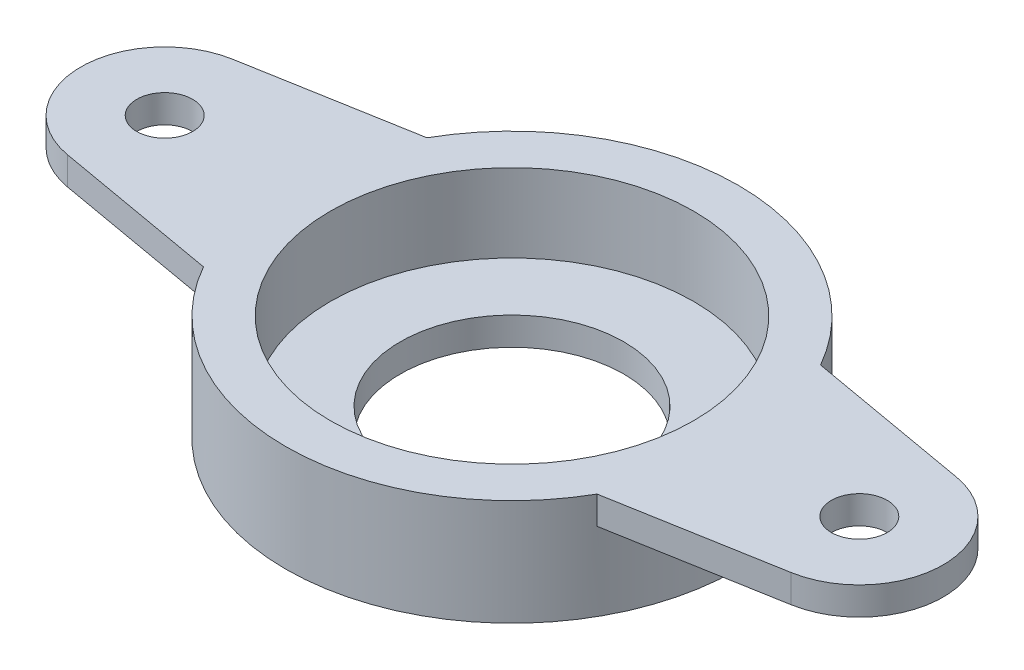
ISO-10303-21;
HEADER;
FILE_DESCRIPTION(('STEP AP214'),'2;1');
FILE_NAME('part.step','',(''),(''),'','','');
FILE_SCHEMA(('AUTOMOTIVE_DESIGN { 1 0 10303 214 1 1 1 1 }'));
ENDSEC;
DATA;
#1=APPLICATION_CONTEXT('core data for automotive mechanical design processes');
#2=APPLICATION_PROTOCOL_DEFINITION('international standard','automotive_design',2000,#1);
#3=PRODUCT_CONTEXT('',#1,'mechanical');
#4=PRODUCT('Part','Part','',(#3));
#5=PRODUCT_RELATED_PRODUCT_CATEGORY('part','',(#4));
#6=PRODUCT_DEFINITION_FORMATION('','',#4);
#7=PRODUCT_DEFINITION_CONTEXT('part definition',#1,'design');
#8=PRODUCT_DEFINITION('design','',#6,#7);
#9=PRODUCT_DEFINITION_SHAPE('','',#8);
#10=(LENGTH_UNIT() NAMED_UNIT(*) SI_UNIT(.MILLI.,.METRE.));
#11=(NAMED_UNIT(*) PLANE_ANGLE_UNIT() SI_UNIT($,.RADIAN.));
#12=(NAMED_UNIT(*) SI_UNIT($,.STERADIAN.) SOLID_ANGLE_UNIT());
#13=UNCERTAINTY_MEASURE_WITH_UNIT(LENGTH_MEASURE(1.E-05),#10,'distance_accuracy_value','');
#14=(GEOMETRIC_REPRESENTATION_CONTEXT(3) GLOBAL_UNCERTAINTY_ASSIGNED_CONTEXT((#13)) GLOBAL_UNIT_ASSIGNED_CONTEXT((#10,
#11,#12)) REPRESENTATION_CONTEXT('',''));
#15=CARTESIAN_POINT('',(0.,0.,0.));
#16=DIRECTION('',(0.,0.,1.));
#17=DIRECTION('',(1.,0.,0.));
#18=AXIS2_PLACEMENT_3D('',#15,#16,#17);
#19=CARTESIAN_POINT('',(0.,8.89,0.));
#20=DIRECTION('',(0.,1.,0.));
#21=DIRECTION('',(0.,0.,1.));
#22=AXIS2_PLACEMENT_3D('',#19,#20,#21);
#23=PLANE('',#22);
#24=CARTESIAN_POINT('',(0.,8.89,0.));
#25=DIRECTION('',(0.,1.,0.));
#26=DIRECTION('',(0.,0.,1.));
#27=AXIS2_PLACEMENT_3D('',#24,#25,#26);
#28=CIRCLE('',#27,25.7175);
#29=CARTESIAN_POINT('',(22.3629113992342,8.89,-12.7));
#30=VERTEX_POINT('',#29);
#31=CARTESIAN_POINT('',(-22.3629113992342,8.89,-12.7));
#32=VERTEX_POINT('',#31);
#33=EDGE_CURVE('E11',#30,#32,#28,.T.);
#34=ORIENTED_EDGE('',*,*,#33,.T.);
#35=DIRECTION('',(-0.984807753012208,0.,0.173648177666931));
#36=VECTOR('',#35,1.);
#37=CARTESIAN_POINT('',(-22.3629113992342,8.89,-12.7));
#38=LINE('',#37,#36);
#39=CARTESIAN_POINT('',(-41.1234990941168,8.89,-9.39200221544497));
#40=VERTEX_POINT('',#39);
#41=EDGE_CURVE('E121',#32,#40,#38,.T.);
#42=ORIENTED_EDGE('',*,*,#41,.T.);
#43=CARTESIAN_POINT('',(-39.4674357006602,8.89,0.));
#44=DIRECTION('',(0.,1.,0.));
#45=DIRECTION('',(0.,0.,1.));
#46=AXIS2_PLACEMENT_3D('',#43,#44,#45);
#47=CIRCLE('',#46,9.53688898845269);
#48=CARTESIAN_POINT('',(-41.1234990941168,8.89,9.39200221544496));
#49=VERTEX_POINT('',#48);
#50=EDGE_CURVE('E131',#40,#49,#47,.T.);
#51=ORIENTED_EDGE('',*,*,#50,.T.);
#52=DIRECTION('',(0.984807753012208,0.,0.173648177666931));
#53=VECTOR('',#52,1.);
#54=CARTESIAN_POINT('',(-22.3629113992342,8.89,12.7));
#55=LINE('',#54,#53);
#56=CARTESIAN_POINT('',(-22.3629113992342,8.89,12.7));
#57=VERTEX_POINT('',#56);
#58=EDGE_CURVE('E49',#49,#57,#55,.T.);
#59=ORIENTED_EDGE('',*,*,#58,.T.);
#60=CARTESIAN_POINT('',(22.3629113992342,8.89,12.7));
#61=VERTEX_POINT('',#60);
#62=EDGE_CURVE('E42',#57,#61,#28,.T.);
#63=ORIENTED_EDGE('',*,*,#62,.T.);
#64=DIRECTION('',(0.984807753012208,0.,-0.173648177666931));
#65=VECTOR('',#64,1.);
#66=CARTESIAN_POINT('',(22.3629113992342,8.89,12.7));
#67=LINE('',#66,#65);
#68=CARTESIAN_POINT('',(41.1234990941168,8.89,9.39200221544496));
#69=VERTEX_POINT('',#68);
#70=EDGE_CURVE('E144',#61,#69,#67,.T.);
#71=ORIENTED_EDGE('',*,*,#70,.T.);
#72=CARTESIAN_POINT('',(39.4674357006602,8.89,0.));
#73=DIRECTION('',(0.,1.,0.));
#74=DIRECTION('',(0.,0.,-1.));
#75=AXIS2_PLACEMENT_3D('',#72,#73,#74);
#76=CIRCLE('',#75,9.53688898845269);
#77=CARTESIAN_POINT('',(41.1234990941168,8.89,-9.39200221544497));
#78=VERTEX_POINT('',#77);
#79=EDGE_CURVE('E162',#69,#78,#76,.T.);
#80=ORIENTED_EDGE('',*,*,#79,.T.);
#81=DIRECTION('',(-0.984807753012208,0.,-0.173648177666931));
#82=VECTOR('',#81,1.);
#83=CARTESIAN_POINT('',(22.3629113992342,8.89,-12.7));
#84=LINE('',#83,#82);
#85=EDGE_CURVE('E55',#78,#30,#84,.T.);
#86=ORIENTED_EDGE('',*,*,#85,.T.);
#87=EDGE_LOOP('',(#34,#42,#51,#59,#63,#71,#80,#86));
#88=FACE_BOUND('',#87,.T.);
#89=CARTESIAN_POINT('',(0.,8.89,0.));
#90=DIRECTION('',(0.,1.,0.));
#91=DIRECTION('',(0.,0.,1.));
#92=AXIS2_PLACEMENT_3D('',#89,#90,#91);
#93=CIRCLE('',#92,20.6375);
#94=CARTESIAN_POINT('',(0.,8.89,20.6375));
#95=VERTEX_POINT('',#94);
#96=EDGE_CURVE('E183',#95,#95,#93,.T.);
#97=ORIENTED_EDGE('',*,*,#96,.F.);
#98=EDGE_LOOP('',(#97));
#99=FACE_BOUND('',#98,.T.);
#100=CARTESIAN_POINT('',(39.4674357006602,8.89,0.));
#101=DIRECTION('',(0.,1.,0.));
#102=DIRECTION('',(0.,0.,1.));
#103=AXIS2_PLACEMENT_3D('',#100,#101,#102);
#104=CIRCLE('',#103,3.175);
#105=CARTESIAN_POINT('',(39.4674357006602,8.89,3.17499999999999));
#106=VERTEX_POINT('',#105);
#107=EDGE_CURVE('E136',#106,#106,#104,.T.);
#108=ORIENTED_EDGE('',*,*,#107,.F.);
#109=EDGE_LOOP('',(#108));
#110=FACE_BOUND('',#109,.T.);
#111=CARTESIAN_POINT('',(-39.4674357006602,8.89,0.));
#112=DIRECTION('',(0.,1.,0.));
#113=DIRECTION('',(0.,0.,-1.));
#114=AXIS2_PLACEMENT_3D('',#111,#112,#113);
#115=CIRCLE('',#114,3.175);
#116=CARTESIAN_POINT('',(-39.4674357006602,8.89,-3.175));
#117=VERTEX_POINT('',#116);
#118=EDGE_CURVE('E126',#117,#117,#115,.T.);
#119=ORIENTED_EDGE('',*,*,#118,.F.);
#120=EDGE_LOOP('',(#119));
#121=FACE_BOUND('',#120,.T.);
#122=ADVANCED_FACE('F34',(#88,#99,#110,#121),#23,.T.);
#123=CARTESIAN_POINT('',(0.,8.89,0.));
#124=DIRECTION('',(0.,-1.,0.));
#125=DIRECTION('',(0.,0.,-1.));
#126=AXIS2_PLACEMENT_3D('',#123,#124,#125);
#127=CYLINDRICAL_SURFACE('',#126,25.7175);
#128=CARTESIAN_POINT('',(0.,5.715,0.));
#129=DIRECTION('',(0.,-1.,0.));
#130=DIRECTION('',(0.,0.,1.));
#131=AXIS2_PLACEMENT_3D('',#128,#129,#130);
#132=CIRCLE('',#131,25.7175);
#133=CARTESIAN_POINT('',(-22.3629113992342,5.715,12.7));
#134=VERTEX_POINT('',#133);
#135=CARTESIAN_POINT('',(-22.3629113992342,5.715,-12.7));
#136=VERTEX_POINT('',#135);
#137=EDGE_CURVE('E117',#134,#136,#132,.T.);
#138=ORIENTED_EDGE('',*,*,#137,.T.);
#139=DIRECTION('',(0.,1.,0.));
#140=VECTOR('',#139,1.);
#141=CARTESIAN_POINT('',(-22.3629113992342,5.715,-12.7));
#142=LINE('',#141,#140);
#143=EDGE_CURVE('E137',#136,#32,#142,.T.);
#144=ORIENTED_EDGE('',*,*,#143,.T.);
#145=ORIENTED_EDGE('',*,*,#33,.F.);
#146=DIRECTION('',(0.,1.,0.));
#147=VECTOR('',#146,1.);
#148=CARTESIAN_POINT('',(22.3629113992342,5.715,-12.7));
#149=LINE('',#148,#147);
#150=CARTESIAN_POINT('',(22.3629113992342,5.715,-12.7));
#151=VERTEX_POINT('',#150);
#152=EDGE_CURVE('E165',#151,#30,#149,.T.);
#153=ORIENTED_EDGE('',*,*,#152,.F.);
#154=CARTESIAN_POINT('',(0.,5.715,0.));
#155=DIRECTION('',(0.,-1.,0.));
#156=DIRECTION('',(0.,0.,-1.));
#157=AXIS2_PLACEMENT_3D('',#154,#155,#156);
#158=CIRCLE('',#157,25.7175);
#159=CARTESIAN_POINT('',(22.3629113992342,5.715,12.7));
#160=VERTEX_POINT('',#159);
#161=EDGE_CURVE('E147',#151,#160,#158,.T.);
#162=ORIENTED_EDGE('',*,*,#161,.T.);
#163=DIRECTION('',(0.,1.,0.));
#164=VECTOR('',#163,1.);
#165=CARTESIAN_POINT('',(22.3629113992342,5.715,12.7));
#166=LINE('',#165,#164);
#167=EDGE_CURVE('E159',#160,#61,#166,.T.);
#168=ORIENTED_EDGE('',*,*,#167,.T.);
#169=ORIENTED_EDGE('',*,*,#62,.F.);
#170=DIRECTION('',(0.,1.,0.));
#171=VECTOR('',#170,1.);
#172=CARTESIAN_POINT('',(-22.3629113992342,5.715,12.7));
#173=LINE('',#172,#171);
#174=EDGE_CURVE('E107',#134,#57,#173,.T.);
#175=ORIENTED_EDGE('',*,*,#174,.F.);
#176=EDGE_LOOP('',(#138,#144,#145,#153,#162,#168,#169,#175));
#177=FACE_BOUND('',#176,.T.);
#178=CARTESIAN_POINT('',(0.,-3.175,0.));
#179=DIRECTION('',(0.,-1.,0.));
#180=DIRECTION('',(0.,0.,-1.));
#181=AXIS2_PLACEMENT_3D('',#178,#179,#180);
#182=CIRCLE('',#181,25.7175);
#183=CARTESIAN_POINT('',(0.,-3.175,-25.7175));
#184=VERTEX_POINT('',#183);
#185=EDGE_CURVE('E177',#184,#184,#182,.T.);
#186=ORIENTED_EDGE('',*,*,#185,.F.);
#187=EDGE_LOOP('',(#186));
#188=FACE_BOUND('',#187,.T.);
#189=ADVANCED_FACE('F36',(#177,#188),#127,.T.);
#190=CARTESIAN_POINT('',(0.,8.89,0.));
#191=DIRECTION('',(0.,-1.,0.));
#192=DIRECTION('',(0.,0.,-1.));
#193=AXIS2_PLACEMENT_3D('',#190,#191,#192);
#194=CYLINDRICAL_SURFACE('',#193,20.6375);
#195=ORIENTED_EDGE('',*,*,#96,.T.);
#196=EDGE_LOOP('',(#195));
#197=FACE_BOUND('',#196,.T.);
#198=CARTESIAN_POINT('',(0.,0.,0.));
#199=DIRECTION('',(0.,1.,0.));
#200=DIRECTION('',(0.,0.,1.));
#201=AXIS2_PLACEMENT_3D('',#198,#199,#200);
#202=CIRCLE('',#201,20.6375);
#203=CARTESIAN_POINT('',(0.,0.,20.6375));
#204=VERTEX_POINT('',#203);
#205=EDGE_CURVE('E182',#204,#204,#202,.T.);
#206=ORIENTED_EDGE('',*,*,#205,.F.);
#207=EDGE_LOOP('',(#206));
#208=FACE_BOUND('',#207,.T.);
#209=ADVANCED_FACE('F190',(#197,#208),#194,.F.);
#210=CARTESIAN_POINT('',(0.,0.,0.));
#211=DIRECTION('',(0.,-1.,0.));
#212=DIRECTION('',(0.,0.,-1.));
#213=AXIS2_PLACEMENT_3D('',#210,#211,#212);
#214=PLANE('',#213);
#215=CARTESIAN_POINT('',(0.,0.,0.));
#216=DIRECTION('',(0.,-1.,0.));
#217=DIRECTION('',(0.,0.,-1.));
#218=AXIS2_PLACEMENT_3D('',#215,#216,#217);
#219=CIRCLE('',#218,12.7);
#220=CARTESIAN_POINT('',(0.,0.,-12.7));
#221=VERTEX_POINT('',#220);
#222=EDGE_CURVE('E167',#221,#221,#219,.T.);
#223=ORIENTED_EDGE('',*,*,#222,.T.);
#224=EDGE_LOOP('',(#223));
#225=FACE_BOUND('',#224,.T.);
#226=ORIENTED_EDGE('',*,*,#205,.T.);
#227=EDGE_LOOP('',(#226));
#228=FACE_BOUND('',#227,.T.);
#229=ADVANCED_FACE('F188',(#225,#228),#214,.F.);
#230=CARTESIAN_POINT('',(0.,-3.175,0.));
#231=DIRECTION('',(0.,-1.,0.));
#232=DIRECTION('',(0.,0.,-1.));
#233=AXIS2_PLACEMENT_3D('',#230,#231,#232);
#234=PLANE('',#233);
#235=ORIENTED_EDGE('',*,*,#185,.T.);
#236=EDGE_LOOP('',(#235));
#237=FACE_BOUND('',#236,.T.);
#238=CARTESIAN_POINT('',(0.,-3.175,0.));
#239=DIRECTION('',(0.,-1.,0.));
#240=DIRECTION('',(0.,0.,-1.));
#241=AXIS2_PLACEMENT_3D('',#238,#239,#240);
#242=CIRCLE('',#241,12.7);
#243=CARTESIAN_POINT('',(0.,-3.175,-12.7));
#244=VERTEX_POINT('',#243);
#245=EDGE_CURVE('E174',#244,#244,#242,.T.);
#246=ORIENTED_EDGE('',*,*,#245,.F.);
#247=EDGE_LOOP('',(#246));
#248=FACE_BOUND('',#247,.T.);
#249=ADVANCED_FACE('F198',(#237,#248),#234,.T.);
#250=CARTESIAN_POINT('',(0.,-3.175,0.));
#251=DIRECTION('',(0.,1.,0.));
#252=DIRECTION('',(0.,0.,1.));
#253=AXIS2_PLACEMENT_3D('',#250,#251,#252);
#254=CYLINDRICAL_SURFACE('',#253,12.7);
#255=ORIENTED_EDGE('',*,*,#245,.T.);
#256=EDGE_LOOP('',(#255));
#257=FACE_BOUND('',#256,.T.);
#258=ORIENTED_EDGE('',*,*,#222,.F.);
#259=EDGE_LOOP('',(#258));
#260=FACE_BOUND('',#259,.T.);
#261=ADVANCED_FACE('F247',(#257,#260),#254,.F.);
#262=CARTESIAN_POINT('',(22.3629113992342,5.715,-12.7));
#263=DIRECTION('',(0.173648177666931,0.,-0.984807753012208));
#264=DIRECTION('',(-0.984807753012208,0.,-0.173648177666931));
#265=AXIS2_PLACEMENT_3D('',#262,#263,#264);
#266=PLANE('',#265);
#267=ORIENTED_EDGE('',*,*,#85,.F.);
#268=DIRECTION('',(0.,1.,0.));
#269=VECTOR('',#268,1.);
#270=CARTESIAN_POINT('',(41.1234990941168,5.715,-9.39200221544497));
#271=LINE('',#270,#269);
#272=CARTESIAN_POINT('',(41.1234990941168,5.715,-9.39200221544497));
#273=VERTEX_POINT('',#272);
#274=EDGE_CURVE('E168',#273,#78,#271,.T.);
#275=ORIENTED_EDGE('',*,*,#274,.F.);
#276=DIRECTION('',(-0.984807753012208,0.,-0.173648177666931));
#277=VECTOR('',#276,1.);
#278=CARTESIAN_POINT('',(22.3629113992342,5.715,-12.7));
#279=LINE('',#278,#277);
#280=EDGE_CURVE('E156',#273,#151,#279,.T.);
#281=ORIENTED_EDGE('',*,*,#280,.T.);
#282=ORIENTED_EDGE('',*,*,#152,.T.);
#283=EDGE_LOOP('',(#267,#275,#281,#282));
#284=FACE_BOUND('',#283,.T.);
#285=ADVANCED_FACE('F243',(#284),#266,.T.);
#286=CARTESIAN_POINT('',(39.4674357006602,5.715,0.));
#287=DIRECTION('',(0.,1.,0.));
#288=DIRECTION('',(0.,0.,1.));
#289=AXIS2_PLACEMENT_3D('',#286,#287,#288);
#290=CYLINDRICAL_SURFACE('',#289,9.53688898845269);
#291=ORIENTED_EDGE('',*,*,#79,.F.);
#292=DIRECTION('',(0.,1.,0.));
#293=VECTOR('',#292,1.);
#294=CARTESIAN_POINT('',(41.1234990941168,5.715,9.39200221544496));
#295=LINE('',#294,#293);
#296=CARTESIAN_POINT('',(41.1234990941168,5.715,9.39200221544496));
#297=VERTEX_POINT('',#296);
#298=EDGE_CURVE('E170',#297,#69,#295,.T.);
#299=ORIENTED_EDGE('',*,*,#298,.F.);
#300=CARTESIAN_POINT('',(39.4674357006602,5.715,0.));
#301=DIRECTION('',(0.,1.,0.));
#302=DIRECTION('',(0.,0.,-1.));
#303=AXIS2_PLACEMENT_3D('',#300,#301,#302);
#304=CIRCLE('',#303,9.53688898845269);
#305=EDGE_CURVE('E153',#297,#273,#304,.T.);
#306=ORIENTED_EDGE('',*,*,#305,.T.);
#307=ORIENTED_EDGE('',*,*,#274,.T.);
#308=EDGE_LOOP('',(#291,#299,#306,#307));
#309=FACE_BOUND('',#308,.T.);
#310=ADVANCED_FACE('F246',(#309),#290,.T.);
#311=CARTESIAN_POINT('',(22.3629113992342,5.715,12.7));
#312=DIRECTION('',(0.173648177666931,0.,0.984807753012208));
#313=DIRECTION('',(0.984807753012208,0.,-0.173648177666931));
#314=AXIS2_PLACEMENT_3D('',#311,#312,#313);
#315=PLANE('',#314);
#316=ORIENTED_EDGE('',*,*,#70,.F.);
#317=ORIENTED_EDGE('',*,*,#167,.F.);
#318=DIRECTION('',(0.984807753012208,0.,-0.173648177666931));
#319=VECTOR('',#318,1.);
#320=CARTESIAN_POINT('',(22.3629113992342,5.715,12.7));
#321=LINE('',#320,#319);
#322=EDGE_CURVE('E150',#160,#297,#321,.T.);
#323=ORIENTED_EDGE('',*,*,#322,.T.);
#324=ORIENTED_EDGE('',*,*,#298,.T.);
#325=EDGE_LOOP('',(#316,#317,#323,#324));
#326=FACE_BOUND('',#325,.T.);
#327=ADVANCED_FACE('F241',(#326),#315,.T.);
#328=CARTESIAN_POINT('',(0.,5.715,0.));
#329=DIRECTION('',(0.,-1.,0.));
#330=DIRECTION('',(0.,0.,-1.));
#331=AXIS2_PLACEMENT_3D('',#328,#329,#330);
#332=PLANE('',#331);
#333=CARTESIAN_POINT('',(39.4674357006602,5.715,0.));
#334=DIRECTION('',(0.,1.,0.));
#335=DIRECTION('',(0.,0.,1.));
#336=AXIS2_PLACEMENT_3D('',#333,#334,#335);
#337=CIRCLE('',#336,3.175);
#338=CARTESIAN_POINT('',(39.4674357006602,5.715,3.17499999999999));
#339=VERTEX_POINT('',#338);
#340=EDGE_CURVE('E141',#339,#339,#337,.T.);
#341=ORIENTED_EDGE('',*,*,#340,.T.);
#342=EDGE_LOOP('',(#341));
#343=FACE_BOUND('',#342,.T.);
#344=ORIENTED_EDGE('',*,*,#161,.F.);
#345=ORIENTED_EDGE('',*,*,#280,.F.);
#346=ORIENTED_EDGE('',*,*,#305,.F.);
#347=ORIENTED_EDGE('',*,*,#322,.F.);
#348=EDGE_LOOP('',(#344,#345,#346,#347));
#349=FACE_BOUND('',#348,.T.);
#350=ADVANCED_FACE('F237',(#343,#349),#332,.T.);
#351=CARTESIAN_POINT('',(39.4674357006602,5.715,0.));
#352=DIRECTION('',(0.,1.,0.));
#353=DIRECTION('',(0.,0.,1.));
#354=AXIS2_PLACEMENT_3D('',#351,#352,#353);
#355=CYLINDRICAL_SURFACE('',#354,3.175);
#356=ORIENTED_EDGE('',*,*,#340,.F.);
#357=EDGE_LOOP('',(#356));
#358=FACE_BOUND('',#357,.T.);
#359=ORIENTED_EDGE('',*,*,#107,.T.);
#360=EDGE_LOOP('',(#359));
#361=FACE_BOUND('',#360,.T.);
#362=ADVANCED_FACE('F234',(#358,#361),#355,.F.);
#363=CARTESIAN_POINT('',(-39.4674357006602,5.715,0.));
#364=DIRECTION('',(0.,1.,0.));
#365=DIRECTION('',(0.,0.,1.));
#366=AXIS2_PLACEMENT_3D('',#363,#364,#365);
#367=CYLINDRICAL_SURFACE('',#366,9.53688898845269);
#368=ORIENTED_EDGE('',*,*,#50,.F.);
#369=DIRECTION('',(0.,1.,0.));
#370=VECTOR('',#369,1.);
#371=CARTESIAN_POINT('',(-41.1234990941168,5.715,-9.39200221544497));
#372=LINE('',#371,#370);
#373=CARTESIAN_POINT('',(-41.1234990941168,5.715,-9.39200221544497));
#374=VERTEX_POINT('',#373);
#375=EDGE_CURVE('E120',#374,#40,#372,.T.);
#376=ORIENTED_EDGE('',*,*,#375,.F.);
#377=CARTESIAN_POINT('',(-39.4674357006602,5.715,0.));
#378=DIRECTION('',(0.,1.,0.));
#379=DIRECTION('',(0.,0.,1.));
#380=AXIS2_PLACEMENT_3D('',#377,#378,#379);
#381=CIRCLE('',#380,9.53688898845269);
#382=CARTESIAN_POINT('',(-41.1234990941168,5.715,9.39200221544496));
#383=VERTEX_POINT('',#382);
#384=EDGE_CURVE('E114',#374,#383,#381,.T.);
#385=ORIENTED_EDGE('',*,*,#384,.T.);
#386=DIRECTION('',(0.,1.,0.));
#387=VECTOR('',#386,1.);
#388=CARTESIAN_POINT('',(-41.1234990941168,5.715,9.39200221544496));
#389=LINE('',#388,#387);
#390=EDGE_CURVE('E99',#383,#49,#389,.T.);
#391=ORIENTED_EDGE('',*,*,#390,.T.);
#392=EDGE_LOOP('',(#368,#376,#385,#391));
#393=FACE_BOUND('',#392,.T.);
#394=ADVANCED_FACE('F119',(#393),#367,.T.);
#395=CARTESIAN_POINT('',(-22.3629113992342,5.715,-12.7));
#396=DIRECTION('',(-0.173648177666931,0.,-0.984807753012208));
#397=DIRECTION('',(-0.984807753012208,0.,0.173648177666931));
#398=AXIS2_PLACEMENT_3D('',#395,#396,#397);
#399=PLANE('',#398);
#400=ORIENTED_EDGE('',*,*,#41,.F.);
#401=ORIENTED_EDGE('',*,*,#143,.F.);
#402=DIRECTION('',(-0.984807753012208,0.,0.173648177666931));
#403=VECTOR('',#402,1.);
#404=CARTESIAN_POINT('',(-22.3629113992342,5.715,-12.7));
#405=LINE('',#404,#403);
#406=EDGE_CURVE('E108',#136,#374,#405,.T.);
#407=ORIENTED_EDGE('',*,*,#406,.T.);
#408=ORIENTED_EDGE('',*,*,#375,.T.);
#409=EDGE_LOOP('',(#400,#401,#407,#408));
#410=FACE_BOUND('',#409,.T.);
#411=ADVANCED_FACE('F226',(#410),#399,.T.);
#412=CARTESIAN_POINT('',(-22.3629113992342,5.715,12.7));
#413=DIRECTION('',(-0.173648177666931,0.,0.984807753012208));
#414=DIRECTION('',(0.984807753012208,0.,0.173648177666931));
#415=AXIS2_PLACEMENT_3D('',#412,#413,#414);
#416=PLANE('',#415);
#417=ORIENTED_EDGE('',*,*,#58,.F.);
#418=ORIENTED_EDGE('',*,*,#390,.F.);
#419=DIRECTION('',(0.984807753012208,0.,0.173648177666931));
#420=VECTOR('',#419,1.);
#421=CARTESIAN_POINT('',(-22.3629113992342,5.715,12.7));
#422=LINE('',#421,#420);
#423=EDGE_CURVE('E102',#383,#134,#422,.T.);
#424=ORIENTED_EDGE('',*,*,#423,.T.);
#425=ORIENTED_EDGE('',*,*,#174,.T.);
#426=EDGE_LOOP('',(#417,#418,#424,#425));
#427=FACE_BOUND('',#426,.T.);
#428=ADVANCED_FACE('F101',(#427),#416,.T.);
#429=CARTESIAN_POINT('',(-39.4674357006602,5.715,0.));
#430=DIRECTION('',(0.,1.,0.));
#431=DIRECTION('',(0.,0.,1.));
#432=AXIS2_PLACEMENT_3D('',#429,#430,#431);
#433=PLANE('',#432);
#434=CARTESIAN_POINT('',(-39.4674357006602,5.715,0.));
#435=DIRECTION('',(0.,1.,0.));
#436=DIRECTION('',(0.,0.,-1.));
#437=AXIS2_PLACEMENT_3D('',#434,#435,#436);
#438=CIRCLE('',#437,3.175);
#439=CARTESIAN_POINT('',(-39.4674357006602,5.715,-3.175));
#440=VERTEX_POINT('',#439);
#441=EDGE_CURVE('E133',#440,#440,#438,.T.);
#442=ORIENTED_EDGE('',*,*,#441,.T.);
#443=EDGE_LOOP('',(#442));
#444=FACE_BOUND('',#443,.T.);
#445=ORIENTED_EDGE('',*,*,#384,.F.);
#446=ORIENTED_EDGE('',*,*,#406,.F.);
#447=ORIENTED_EDGE('',*,*,#137,.F.);
#448=ORIENTED_EDGE('',*,*,#423,.F.);
#449=EDGE_LOOP('',(#445,#446,#447,#448));
#450=FACE_BOUND('',#449,.T.);
#451=ADVANCED_FACE('F112',(#444,#450),#433,.F.);
#452=CARTESIAN_POINT('',(-39.4674357006602,5.715,0.));
#453=DIRECTION('',(0.,1.,0.));
#454=DIRECTION('',(0.,0.,1.));
#455=AXIS2_PLACEMENT_3D('',#452,#453,#454);
#456=CYLINDRICAL_SURFACE('',#455,3.175);
#457=ORIENTED_EDGE('',*,*,#441,.F.);
#458=EDGE_LOOP('',(#457));
#459=FACE_BOUND('',#458,.T.);
#460=ORIENTED_EDGE('',*,*,#118,.T.);
#461=EDGE_LOOP('',(#460));
#462=FACE_BOUND('',#461,.T.);
#463=ADVANCED_FACE('F218',(#459,#462),#456,.F.);
#464=CLOSED_SHELL('',(#122,#189,#209,#229,#249,#261,#285,#310,#327,#350,#362,#394,#411,#428,
#451,#463));
#465=MANIFOLD_SOLID_BREP('B2',#464);
#466=ADVANCED_BREP_SHAPE_REPRESENTATION('',(#18,#465),#14);
#467=SHAPE_DEFINITION_REPRESENTATION(#9,#466);
ENDSEC;
END-ISO-10303-21;
